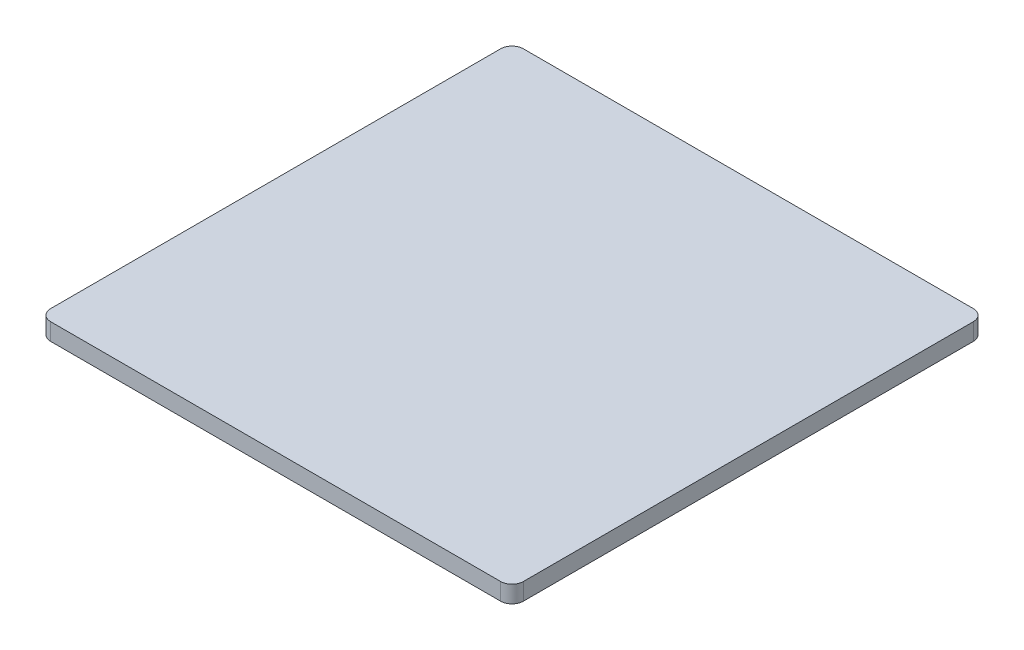
ISO-10303-21;
HEADER;
FILE_DESCRIPTION(('STEP AP214'),'2;1');
FILE_NAME('part.step','',(''),(''),'','','');
FILE_SCHEMA(('AUTOMOTIVE_DESIGN { 1 0 10303 214 1 1 1 1 }'));
ENDSEC;
DATA;
#1=APPLICATION_CONTEXT('core data for automotive mechanical design processes');
#2=APPLICATION_PROTOCOL_DEFINITION('international standard','automotive_design',2000,#1);
#3=PRODUCT_CONTEXT('',#1,'mechanical');
#4=PRODUCT('Part','Part','',(#3));
#5=PRODUCT_RELATED_PRODUCT_CATEGORY('part','',(#4));
#6=PRODUCT_DEFINITION_FORMATION('','',#4);
#7=PRODUCT_DEFINITION_CONTEXT('part definition',#1,'design');
#8=PRODUCT_DEFINITION('design','',#6,#7);
#9=PRODUCT_DEFINITION_SHAPE('','',#8);
#10=(LENGTH_UNIT() NAMED_UNIT(*) SI_UNIT(.MILLI.,.METRE.));
#11=(NAMED_UNIT(*) PLANE_ANGLE_UNIT() SI_UNIT($,.RADIAN.));
#12=(NAMED_UNIT(*) SI_UNIT($,.STERADIAN.) SOLID_ANGLE_UNIT());
#13=UNCERTAINTY_MEASURE_WITH_UNIT(LENGTH_MEASURE(1.E-05),#10,'distance_accuracy_value','');
#14=(GEOMETRIC_REPRESENTATION_CONTEXT(3) GLOBAL_UNCERTAINTY_ASSIGNED_CONTEXT((#13)) GLOBAL_UNIT_ASSIGNED_CONTEXT((#10,
#11,#12)) REPRESENTATION_CONTEXT('',''));
#15=CARTESIAN_POINT('',(0.,0.,0.));
#16=DIRECTION('',(0.,0.,1.));
#17=DIRECTION('',(1.,0.,0.));
#18=AXIS2_PLACEMENT_3D('',#15,#16,#17);
#19=CARTESIAN_POINT('',(-197.5,-15.,-197.5));
#20=DIRECTION('',(0.,1.,0.));
#21=DIRECTION('',(0.,0.,1.));
#22=AXIS2_PLACEMENT_3D('',#19,#20,#21);
#23=CYLINDRICAL_SURFACE('',#22,10.);
#24=CARTESIAN_POINT('',(-197.5,0.,-197.5));
#25=DIRECTION('',(0.,1.,0.));
#26=DIRECTION('',(0.,0.,1.));
#27=AXIS2_PLACEMENT_3D('',#24,#25,#26);
#28=CIRCLE('',#27,10.);
#29=CARTESIAN_POINT('',(-197.5,0.,-207.5));
#30=VERTEX_POINT('',#29);
#31=CARTESIAN_POINT('',(-207.5,0.,-197.5));
#32=VERTEX_POINT('',#31);
#33=EDGE_CURVE('E328',#30,#32,#28,.T.);
#34=ORIENTED_EDGE('',*,*,#33,.F.);
#35=DIRECTION('',(0.,1.,0.));
#36=VECTOR('',#35,1.);
#37=CARTESIAN_POINT('',(-197.5,-15.,-207.5));
#38=LINE('',#37,#36);
#39=CARTESIAN_POINT('',(-197.5,-15.,-207.5));
#40=VERTEX_POINT('',#39);
#41=EDGE_CURVE('E391',#40,#30,#38,.T.);
#42=ORIENTED_EDGE('',*,*,#41,.F.);
#43=CARTESIAN_POINT('',(-197.5,-15.,-197.5));
#44=DIRECTION('',(0.,1.,0.));
#45=DIRECTION('',(0.,0.,1.));
#46=AXIS2_PLACEMENT_3D('',#43,#44,#45);
#47=CIRCLE('',#46,10.);
#48=CARTESIAN_POINT('',(-207.5,-15.,-197.5));
#49=VERTEX_POINT('',#48);
#50=EDGE_CURVE('E343',#40,#49,#47,.T.);
#51=ORIENTED_EDGE('',*,*,#50,.T.);
#52=DIRECTION('',(0.,1.,0.));
#53=VECTOR('',#52,1.);
#54=CARTESIAN_POINT('',(-207.5,-15.,-197.5));
#55=LINE('',#54,#53);
#56=EDGE_CURVE('E368',#49,#32,#55,.T.);
#57=ORIENTED_EDGE('',*,*,#56,.T.);
#58=EDGE_LOOP('',(#34,#42,#51,#57));
#59=FACE_BOUND('',#58,.T.);
#60=ADVANCED_FACE('F35',(#59),#23,.T.);
#61=CARTESIAN_POINT('',(-197.5,-15.,-207.5));
#62=DIRECTION('',(0.,0.,-1.));
#63=DIRECTION('',(-1.,0.,0.));
#64=AXIS2_PLACEMENT_3D('',#61,#62,#63);
#65=PLANE('',#64);
#66=DIRECTION('',(-1.,0.,0.));
#67=VECTOR('',#66,1.);
#68=CARTESIAN_POINT('',(-197.5,0.,-207.5));
#69=LINE('',#68,#67);
#70=CARTESIAN_POINT('',(197.5,0.,-207.5));
#71=VERTEX_POINT('',#70);
#72=EDGE_CURVE('E347',#71,#30,#69,.T.);
#73=ORIENTED_EDGE('',*,*,#72,.F.);
#74=DIRECTION('',(0.,1.,0.));
#75=VECTOR('',#74,1.);
#76=CARTESIAN_POINT('',(197.5,-15.,-207.5));
#77=LINE('',#76,#75);
#78=CARTESIAN_POINT('',(197.5,-15.,-207.5));
#79=VERTEX_POINT('',#78);
#80=EDGE_CURVE('E394',#79,#71,#77,.T.);
#81=ORIENTED_EDGE('',*,*,#80,.F.);
#82=DIRECTION('',(-1.,0.,0.));
#83=VECTOR('',#82,1.);
#84=CARTESIAN_POINT('',(-197.5,-15.,-207.5));
#85=LINE('',#84,#83);
#86=EDGE_CURVE('E365',#79,#40,#85,.T.);
#87=ORIENTED_EDGE('',*,*,#86,.T.);
#88=ORIENTED_EDGE('',*,*,#41,.T.);
#89=EDGE_LOOP('',(#73,#81,#87,#88));
#90=FACE_BOUND('',#89,.T.);
#91=ADVANCED_FACE('F513',(#90),#65,.T.);
#92=CARTESIAN_POINT('',(197.5,-15.,-197.5));
#93=DIRECTION('',(0.,1.,0.));
#94=DIRECTION('',(0.,0.,1.));
#95=AXIS2_PLACEMENT_3D('',#92,#93,#94);
#96=CYLINDRICAL_SURFACE('',#95,10.);
#97=CARTESIAN_POINT('',(197.5,0.,-197.5));
#98=DIRECTION('',(0.,1.,0.));
#99=DIRECTION('',(0.,0.,-1.));
#100=AXIS2_PLACEMENT_3D('',#97,#98,#99);
#101=CIRCLE('',#100,10.);
#102=CARTESIAN_POINT('',(207.5,0.,-197.5));
#103=VERTEX_POINT('',#102);
#104=EDGE_CURVE('E386',#103,#71,#101,.T.);
#105=ORIENTED_EDGE('',*,*,#104,.F.);
#106=DIRECTION('',(0.,1.,0.));
#107=VECTOR('',#106,1.);
#108=CARTESIAN_POINT('',(207.5,-15.,-197.5));
#109=LINE('',#108,#107);
#110=CARTESIAN_POINT('',(207.5,-15.,-197.5));
#111=VERTEX_POINT('',#110);
#112=EDGE_CURVE('E396',#111,#103,#109,.T.);
#113=ORIENTED_EDGE('',*,*,#112,.F.);
#114=CARTESIAN_POINT('',(197.5,-15.,-197.5));
#115=DIRECTION('',(0.,1.,0.));
#116=DIRECTION('',(0.,0.,-1.));
#117=AXIS2_PLACEMENT_3D('',#114,#115,#116);
#118=CIRCLE('',#117,10.);
#119=EDGE_CURVE('E362',#111,#79,#118,.T.);
#120=ORIENTED_EDGE('',*,*,#119,.T.);
#121=ORIENTED_EDGE('',*,*,#80,.T.);
#122=EDGE_LOOP('',(#105,#113,#120,#121));
#123=FACE_BOUND('',#122,.T.);
#124=ADVANCED_FACE('F519',(#123),#96,.T.);
#125=CARTESIAN_POINT('',(207.5,-15.,-197.5));
#126=DIRECTION('',(1.,0.,0.));
#127=DIRECTION('',(0.,0.,-1.));
#128=AXIS2_PLACEMENT_3D('',#125,#126,#127);
#129=PLANE('',#128);
#130=DIRECTION('',(0.,0.,-1.));
#131=VECTOR('',#130,1.);
#132=CARTESIAN_POINT('',(207.5,0.,-197.5));
#133=LINE('',#132,#131);
#134=CARTESIAN_POINT('',(207.5,0.,197.5));
#135=VERTEX_POINT('',#134);
#136=EDGE_CURVE('E383',#135,#103,#133,.T.);
#137=ORIENTED_EDGE('',*,*,#136,.F.);
#138=DIRECTION('',(0.,1.,0.));
#139=VECTOR('',#138,1.);
#140=CARTESIAN_POINT('',(207.5,-15.,197.5));
#141=LINE('',#140,#139);
#142=CARTESIAN_POINT('',(207.5,-15.,197.5));
#143=VERTEX_POINT('',#142);
#144=EDGE_CURVE('E398',#143,#135,#141,.T.);
#145=ORIENTED_EDGE('',*,*,#144,.F.);
#146=DIRECTION('',(0.,0.,-1.));
#147=VECTOR('',#146,1.);
#148=CARTESIAN_POINT('',(207.5,-15.,-197.5));
#149=LINE('',#148,#147);
#150=EDGE_CURVE('E359',#143,#111,#149,.T.);
#151=ORIENTED_EDGE('',*,*,#150,.T.);
#152=ORIENTED_EDGE('',*,*,#112,.T.);
#153=EDGE_LOOP('',(#137,#145,#151,#152));
#154=FACE_BOUND('',#153,.T.);
#155=ADVANCED_FACE('F578',(#154),#129,.T.);
#156=CARTESIAN_POINT('',(197.5,-15.,197.5));
#157=DIRECTION('',(0.,1.,0.));
#158=DIRECTION('',(0.,0.,1.));
#159=AXIS2_PLACEMENT_3D('',#156,#157,#158);
#160=CYLINDRICAL_SURFACE('',#159,10.);
#161=CARTESIAN_POINT('',(197.5,0.,197.5));
#162=DIRECTION('',(0.,1.,0.));
#163=DIRECTION('',(0.,0.,1.));
#164=AXIS2_PLACEMENT_3D('',#161,#162,#163);
#165=CIRCLE('',#164,10.);
#166=CARTESIAN_POINT('',(197.5,0.,207.5));
#167=VERTEX_POINT('',#166);
#168=EDGE_CURVE('E380',#167,#135,#165,.T.);
#169=ORIENTED_EDGE('',*,*,#168,.F.);
#170=DIRECTION('',(0.,1.,0.));
#171=VECTOR('',#170,1.);
#172=CARTESIAN_POINT('',(197.5,-15.,207.5));
#173=LINE('',#172,#171);
#174=CARTESIAN_POINT('',(197.5,-15.,207.5));
#175=VERTEX_POINT('',#174);
#176=EDGE_CURVE('E400',#175,#167,#173,.T.);
#177=ORIENTED_EDGE('',*,*,#176,.F.);
#178=CARTESIAN_POINT('',(197.5,-15.,197.5));
#179=DIRECTION('',(0.,1.,0.));
#180=DIRECTION('',(0.,0.,1.));
#181=AXIS2_PLACEMENT_3D('',#178,#179,#180);
#182=CIRCLE('',#181,10.);
#183=EDGE_CURVE('E356',#175,#143,#182,.T.);
#184=ORIENTED_EDGE('',*,*,#183,.T.);
#185=ORIENTED_EDGE('',*,*,#144,.T.);
#186=EDGE_LOOP('',(#169,#177,#184,#185));
#187=FACE_BOUND('',#186,.T.);
#188=ADVANCED_FACE('F581',(#187),#160,.T.);
#189=CARTESIAN_POINT('',(-197.5,-15.,207.5));
#190=DIRECTION('',(0.,0.,1.));
#191=DIRECTION('',(1.,0.,0.));
#192=AXIS2_PLACEMENT_3D('',#189,#190,#191);
#193=PLANE('',#192);
#194=DIRECTION('',(1.,0.,0.));
#195=VECTOR('',#194,1.);
#196=CARTESIAN_POINT('',(-197.5,0.,207.5));
#197=LINE('',#196,#195);
#198=CARTESIAN_POINT('',(-197.5,0.,207.5));
#199=VERTEX_POINT('',#198);
#200=EDGE_CURVE('E377',#199,#167,#197,.T.);
#201=ORIENTED_EDGE('',*,*,#200,.F.);
#202=DIRECTION('',(0.,1.,0.));
#203=VECTOR('',#202,1.);
#204=CARTESIAN_POINT('',(-197.5,-15.,207.5));
#205=LINE('',#204,#203);
#206=CARTESIAN_POINT('',(-197.5,-15.,207.5));
#207=VERTEX_POINT('',#206);
#208=EDGE_CURVE('E402',#207,#199,#205,.T.);
#209=ORIENTED_EDGE('',*,*,#208,.F.);
#210=DIRECTION('',(1.,0.,0.));
#211=VECTOR('',#210,1.);
#212=CARTESIAN_POINT('',(-197.5,-15.,207.5));
#213=LINE('',#212,#211);
#214=EDGE_CURVE('E353',#207,#175,#213,.T.);
#215=ORIENTED_EDGE('',*,*,#214,.T.);
#216=ORIENTED_EDGE('',*,*,#176,.T.);
#217=EDGE_LOOP('',(#201,#209,#215,#216));
#218=FACE_BOUND('',#217,.T.);
#219=ADVANCED_FACE('F585',(#218),#193,.T.);
#220=CARTESIAN_POINT('',(-197.5,-15.,197.5));
#221=DIRECTION('',(0.,1.,0.));
#222=DIRECTION('',(0.,0.,1.));
#223=AXIS2_PLACEMENT_3D('',#220,#221,#222);
#224=CYLINDRICAL_SURFACE('',#223,10.);
#225=CARTESIAN_POINT('',(-197.5,0.,197.5));
#226=DIRECTION('',(0.,1.,0.));
#227=DIRECTION('',(0.,0.,1.));
#228=AXIS2_PLACEMENT_3D('',#225,#226,#227);
#229=CIRCLE('',#228,10.);
#230=CARTESIAN_POINT('',(-207.5,0.,197.5));
#231=VERTEX_POINT('',#230);
#232=EDGE_CURVE('E374',#231,#199,#229,.T.);
#233=ORIENTED_EDGE('',*,*,#232,.F.);
#234=DIRECTION('',(0.,1.,0.));
#235=VECTOR('',#234,1.);
#236=CARTESIAN_POINT('',(-207.5,-15.,197.5));
#237=LINE('',#236,#235);
#238=CARTESIAN_POINT('',(-207.5,-15.,197.5));
#239=VERTEX_POINT('',#238);
#240=EDGE_CURVE('E404',#239,#231,#237,.T.);
#241=ORIENTED_EDGE('',*,*,#240,.F.);
#242=CARTESIAN_POINT('',(-197.5,-15.,197.5));
#243=DIRECTION('',(0.,1.,0.));
#244=DIRECTION('',(0.,0.,1.));
#245=AXIS2_PLACEMENT_3D('',#242,#243,#244);
#246=CIRCLE('',#245,10.);
#247=EDGE_CURVE('E350',#239,#207,#246,.T.);
#248=ORIENTED_EDGE('',*,*,#247,.T.);
#249=ORIENTED_EDGE('',*,*,#208,.T.);
#250=EDGE_LOOP('',(#233,#241,#248,#249));
#251=FACE_BOUND('',#250,.T.);
#252=ADVANCED_FACE('F560',(#251),#224,.T.);
#253=CARTESIAN_POINT('',(-207.5,-15.,-197.5));
#254=DIRECTION('',(-1.,0.,0.));
#255=DIRECTION('',(0.,0.,1.));
#256=AXIS2_PLACEMENT_3D('',#253,#254,#255);
#257=PLANE('',#256);
#258=DIRECTION('',(0.,0.,1.));
#259=VECTOR('',#258,1.);
#260=CARTESIAN_POINT('',(-207.5,0.,-197.5));
#261=LINE('',#260,#259);
#262=EDGE_CURVE('E371',#32,#231,#261,.T.);
#263=ORIENTED_EDGE('',*,*,#262,.F.);
#264=ORIENTED_EDGE('',*,*,#56,.F.);
#265=DIRECTION('',(0.,0.,1.));
#266=VECTOR('',#265,1.);
#267=CARTESIAN_POINT('',(-207.5,-15.,-197.5));
#268=LINE('',#267,#266);
#269=EDGE_CURVE('E346',#49,#239,#268,.T.);
#270=ORIENTED_EDGE('',*,*,#269,.T.);
#271=ORIENTED_EDGE('',*,*,#240,.T.);
#272=EDGE_LOOP('',(#263,#264,#270,#271));
#273=FACE_BOUND('',#272,.T.);
#274=ADVANCED_FACE('F525',(#273),#257,.T.);
#275=CARTESIAN_POINT('',(-197.5,-15.,-197.5));
#276=DIRECTION('',(0.,1.,0.));
#277=DIRECTION('',(0.,0.,1.));
#278=AXIS2_PLACEMENT_3D('',#275,#276,#277);
#279=PLANE('',#278);
#280=DIRECTION('',(1.,0.,0.));
#281=VECTOR('',#280,1.);
#282=CARTESIAN_POINT('',(-190.,-15.,-200.));
#283=LINE('',#282,#281);
#284=CARTESIAN_POINT('',(-190.,-15.,-200.));
#285=VERTEX_POINT('',#284);
#286=CARTESIAN_POINT('',(190.,-15.,-200.));
#287=VERTEX_POINT('',#286);
#288=EDGE_CURVE('E306',#285,#287,#283,.T.);
#289=ORIENTED_EDGE('',*,*,#288,.F.);
#290=DIRECTION('',(0.707106781186547,0.,-0.707106781186547));
#291=VECTOR('',#290,1.);
#292=CARTESIAN_POINT('',(-200.,-15.,-190.));
#293=LINE('',#292,#291);
#294=CARTESIAN_POINT('',(-200.,-15.,-190.));
#295=VERTEX_POINT('',#294);
#296=EDGE_CURVE('E263',#295,#285,#293,.T.);
#297=ORIENTED_EDGE('',*,*,#296,.F.);
#298=DIRECTION('',(0.,0.,-1.));
#299=VECTOR('',#298,1.);
#300=CARTESIAN_POINT('',(-200.,-15.,-190.));
#301=LINE('',#300,#299);
#302=CARTESIAN_POINT('',(-200.,-15.,190.));
#303=VERTEX_POINT('',#302);
#304=EDGE_CURVE('E283',#303,#295,#301,.T.);
#305=ORIENTED_EDGE('',*,*,#304,.F.);
#306=DIRECTION('',(-0.707106781186547,0.,-0.707106781186547));
#307=VECTOR('',#306,1.);
#308=CARTESIAN_POINT('',(-200.,-15.,190.));
#309=LINE('',#308,#307);
#310=CARTESIAN_POINT('',(-190.,-15.,200.));
#311=VERTEX_POINT('',#310);
#312=EDGE_CURVE('E321',#311,#303,#309,.T.);
#313=ORIENTED_EDGE('',*,*,#312,.F.);
#314=DIRECTION('',(-1.,0.,0.));
#315=VECTOR('',#314,1.);
#316=CARTESIAN_POINT('',(-190.,-15.,200.));
#317=LINE('',#316,#315);
#318=CARTESIAN_POINT('',(190.,-15.,200.));
#319=VERTEX_POINT('',#318);
#320=EDGE_CURVE('E318',#319,#311,#317,.T.);
#321=ORIENTED_EDGE('',*,*,#320,.F.);
#322=DIRECTION('',(-0.707106781186547,0.,0.707106781186547));
#323=VECTOR('',#322,1.);
#324=CARTESIAN_POINT('',(190.,-15.,200.));
#325=LINE('',#324,#323);
#326=CARTESIAN_POINT('',(200.,-15.,190.));
#327=VERTEX_POINT('',#326);
#328=EDGE_CURVE('E315',#327,#319,#325,.T.);
#329=ORIENTED_EDGE('',*,*,#328,.F.);
#330=DIRECTION('',(0.,0.,1.));
#331=VECTOR('',#330,1.);
#332=CARTESIAN_POINT('',(200.,-15.,-190.));
#333=LINE('',#332,#331);
#334=CARTESIAN_POINT('',(200.,-15.,-190.));
#335=VERTEX_POINT('',#334);
#336=EDGE_CURVE('E312',#335,#327,#333,.T.);
#337=ORIENTED_EDGE('',*,*,#336,.F.);
#338=DIRECTION('',(0.707106781186547,0.,0.707106781186547));
#339=VECTOR('',#338,1.);
#340=CARTESIAN_POINT('',(190.,-15.,-200.));
#341=LINE('',#340,#339);
#342=EDGE_CURVE('E309',#287,#335,#341,.T.);
#343=ORIENTED_EDGE('',*,*,#342,.F.);
#344=EDGE_LOOP('',(#289,#297,#305,#313,#321,#329,#337,#343));
#345=FACE_BOUND('',#344,.T.);
#346=ORIENTED_EDGE('',*,*,#50,.F.);
#347=ORIENTED_EDGE('',*,*,#86,.F.);
#348=ORIENTED_EDGE('',*,*,#119,.F.);
#349=ORIENTED_EDGE('',*,*,#150,.F.);
#350=ORIENTED_EDGE('',*,*,#183,.F.);
#351=ORIENTED_EDGE('',*,*,#214,.F.);
#352=ORIENTED_EDGE('',*,*,#247,.F.);
#353=ORIENTED_EDGE('',*,*,#269,.F.);
#354=EDGE_LOOP('',(#346,#347,#348,#349,#350,#351,#352,#353));
#355=FACE_BOUND('',#354,.T.);
#356=ADVANCED_FACE('F546',(#345,#355),#279,.F.);
#357=CARTESIAN_POINT('',(-197.5,0.,-197.5));
#358=DIRECTION('',(0.,1.,0.));
#359=DIRECTION('',(0.,0.,1.));
#360=AXIS2_PLACEMENT_3D('',#357,#358,#359);
#361=PLANE('',#360);
#362=ORIENTED_EDGE('',*,*,#33,.T.);
#363=ORIENTED_EDGE('',*,*,#262,.T.);
#364=ORIENTED_EDGE('',*,*,#232,.T.);
#365=ORIENTED_EDGE('',*,*,#200,.T.);
#366=ORIENTED_EDGE('',*,*,#168,.T.);
#367=ORIENTED_EDGE('',*,*,#136,.T.);
#368=ORIENTED_EDGE('',*,*,#104,.T.);
#369=ORIENTED_EDGE('',*,*,#72,.T.);
#370=EDGE_LOOP('',(#362,#363,#364,#365,#366,#367,#368,#369));
#371=FACE_BOUND('',#370,.T.);
#372=ADVANCED_FACE('F552',(#371),#361,.T.);
#373=CARTESIAN_POINT('',(-200.,-4.5,-190.));
#374=DIRECTION('',(-0.707106781186547,0.,-0.707106781186547));
#375=DIRECTION('',(-0.707106781186548,0.,0.707106781186548));
#376=AXIS2_PLACEMENT_3D('',#373,#374,#375);
#377=PLANE('',#376);
#378=ORIENTED_EDGE('',*,*,#296,.T.);
#379=DIRECTION('',(0.,-1.,0.));
#380=VECTOR('',#379,1.);
#381=CARTESIAN_POINT('',(-190.,-4.5,-200.));
#382=LINE('',#381,#380);
#383=CARTESIAN_POINT('',(-190.,-4.5,-200.));
#384=VERTEX_POINT('',#383);
#385=EDGE_CURVE('E304',#384,#285,#382,.T.);
#386=ORIENTED_EDGE('',*,*,#385,.F.);
#387=DIRECTION('',(0.707106781186547,0.,-0.707106781186547));
#388=VECTOR('',#387,1.);
#389=CARTESIAN_POINT('',(-200.,-4.5,-190.));
#390=LINE('',#389,#388);
#391=CARTESIAN_POINT('',(-200.,-4.5,-190.));
#392=VERTEX_POINT('',#391);
#393=EDGE_CURVE('E279',#392,#384,#390,.T.);
#394=ORIENTED_EDGE('',*,*,#393,.F.);
#395=DIRECTION('',(0.,-1.,0.));
#396=VECTOR('',#395,1.);
#397=CARTESIAN_POINT('',(-200.,-4.5,-190.));
#398=LINE('',#397,#396);
#399=EDGE_CURVE('E326',#392,#295,#398,.T.);
#400=ORIENTED_EDGE('',*,*,#399,.T.);
#401=EDGE_LOOP('',(#378,#386,#394,#400));
#402=FACE_BOUND('',#401,.T.);
#403=ADVANCED_FACE('F558',(#402),#377,.F.);
#404=CARTESIAN_POINT('',(-200.,-4.5,-190.));
#405=DIRECTION('',(-1.,0.,0.));
#406=DIRECTION('',(0.,0.,1.));
#407=AXIS2_PLACEMENT_3D('',#404,#405,#406);
#408=PLANE('',#407);
#409=ORIENTED_EDGE('',*,*,#304,.T.);
#410=ORIENTED_EDGE('',*,*,#399,.F.);
#411=DIRECTION('',(0.,0.,-1.));
#412=VECTOR('',#411,1.);
#413=CARTESIAN_POINT('',(-200.,-4.5,-190.));
#414=LINE('',#413,#412);
#415=CARTESIAN_POINT('',(-200.,-4.5,190.));
#416=VERTEX_POINT('',#415);
#417=EDGE_CURVE('E301',#416,#392,#414,.T.);
#418=ORIENTED_EDGE('',*,*,#417,.F.);
#419=DIRECTION('',(0.,-1.,0.));
#420=VECTOR('',#419,1.);
#421=CARTESIAN_POINT('',(-200.,-4.5,190.));
#422=LINE('',#421,#420);
#423=EDGE_CURVE('E329',#416,#303,#422,.T.);
#424=ORIENTED_EDGE('',*,*,#423,.T.);
#425=EDGE_LOOP('',(#409,#410,#418,#424));
#426=FACE_BOUND('',#425,.T.);
#427=ADVANCED_FACE('F646',(#426),#408,.F.);
#428=CARTESIAN_POINT('',(-200.,-4.5,190.));
#429=DIRECTION('',(-0.707106781186547,0.,0.707106781186547));
#430=DIRECTION('',(0.707106781186548,0.,0.707106781186548));
#431=AXIS2_PLACEMENT_3D('',#428,#429,#430);
#432=PLANE('',#431);
#433=ORIENTED_EDGE('',*,*,#312,.T.);
#434=ORIENTED_EDGE('',*,*,#423,.F.);
#435=DIRECTION('',(-0.707106781186547,0.,-0.707106781186547));
#436=VECTOR('',#435,1.);
#437=CARTESIAN_POINT('',(-200.,-4.5,190.));
#438=LINE('',#437,#436);
#439=CARTESIAN_POINT('',(-190.,-4.5,200.));
#440=VERTEX_POINT('',#439);
#441=EDGE_CURVE('E298',#440,#416,#438,.T.);
#442=ORIENTED_EDGE('',*,*,#441,.F.);
#443=DIRECTION('',(0.,-1.,0.));
#444=VECTOR('',#443,1.);
#445=CARTESIAN_POINT('',(-190.,-4.5,200.));
#446=LINE('',#445,#444);
#447=EDGE_CURVE('E331',#440,#311,#446,.T.);
#448=ORIENTED_EDGE('',*,*,#447,.T.);
#449=EDGE_LOOP('',(#433,#434,#442,#448));
#450=FACE_BOUND('',#449,.T.);
#451=ADVANCED_FACE('F655',(#450),#432,.F.);
#452=CARTESIAN_POINT('',(-190.,-4.5,200.));
#453=DIRECTION('',(0.,0.,1.));
#454=DIRECTION('',(1.,0.,0.));
#455=AXIS2_PLACEMENT_3D('',#452,#453,#454);
#456=PLANE('',#455);
#457=ORIENTED_EDGE('',*,*,#320,.T.);
#458=ORIENTED_EDGE('',*,*,#447,.F.);
#459=DIRECTION('',(-1.,0.,0.));
#460=VECTOR('',#459,1.);
#461=CARTESIAN_POINT('',(-190.,-4.5,200.));
#462=LINE('',#461,#460);
#463=CARTESIAN_POINT('',(190.,-4.5,200.));
#464=VERTEX_POINT('',#463);
#465=EDGE_CURVE('E295',#464,#440,#462,.T.);
#466=ORIENTED_EDGE('',*,*,#465,.F.);
#467=DIRECTION('',(0.,-1.,0.));
#468=VECTOR('',#467,1.);
#469=CARTESIAN_POINT('',(190.,-4.5,200.));
#470=LINE('',#469,#468);
#471=EDGE_CURVE('E333',#464,#319,#470,.T.);
#472=ORIENTED_EDGE('',*,*,#471,.T.);
#473=EDGE_LOOP('',(#457,#458,#466,#472));
#474=FACE_BOUND('',#473,.T.);
#475=ADVANCED_FACE('F665',(#474),#456,.F.);
#476=CARTESIAN_POINT('',(190.,-4.5,200.));
#477=DIRECTION('',(0.707106781186547,0.,0.707106781186547));
#478=DIRECTION('',(0.707106781186548,0.,-0.707106781186548));
#479=AXIS2_PLACEMENT_3D('',#476,#477,#478);
#480=PLANE('',#479);
#481=ORIENTED_EDGE('',*,*,#328,.T.);
#482=ORIENTED_EDGE('',*,*,#471,.F.);
#483=DIRECTION('',(-0.707106781186547,0.,0.707106781186547));
#484=VECTOR('',#483,1.);
#485=CARTESIAN_POINT('',(190.,-4.5,200.));
#486=LINE('',#485,#484);
#487=CARTESIAN_POINT('',(200.,-4.5,190.));
#488=VERTEX_POINT('',#487);
#489=EDGE_CURVE('E292',#488,#464,#486,.T.);
#490=ORIENTED_EDGE('',*,*,#489,.F.);
#491=DIRECTION('',(0.,-1.,0.));
#492=VECTOR('',#491,1.);
#493=CARTESIAN_POINT('',(200.,-4.5,190.));
#494=LINE('',#493,#492);
#495=EDGE_CURVE('E335',#488,#327,#494,.T.);
#496=ORIENTED_EDGE('',*,*,#495,.T.);
#497=EDGE_LOOP('',(#481,#482,#490,#496));
#498=FACE_BOUND('',#497,.T.);
#499=ADVANCED_FACE('F675',(#498),#480,.F.);
#500=CARTESIAN_POINT('',(200.,-4.5,-190.));
#501=DIRECTION('',(1.,0.,0.));
#502=DIRECTION('',(0.,0.,-1.));
#503=AXIS2_PLACEMENT_3D('',#500,#501,#502);
#504=PLANE('',#503);
#505=ORIENTED_EDGE('',*,*,#336,.T.);
#506=ORIENTED_EDGE('',*,*,#495,.F.);
#507=DIRECTION('',(0.,0.,1.));
#508=VECTOR('',#507,1.);
#509=CARTESIAN_POINT('',(200.,-4.5,-190.));
#510=LINE('',#509,#508);
#511=CARTESIAN_POINT('',(200.,-4.5,-190.));
#512=VERTEX_POINT('',#511);
#513=EDGE_CURVE('E289',#512,#488,#510,.T.);
#514=ORIENTED_EDGE('',*,*,#513,.F.);
#515=DIRECTION('',(0.,-1.,0.));
#516=VECTOR('',#515,1.);
#517=CARTESIAN_POINT('',(200.,-4.5,-190.));
#518=LINE('',#517,#516);
#519=EDGE_CURVE('E337',#512,#335,#518,.T.);
#520=ORIENTED_EDGE('',*,*,#519,.T.);
#521=EDGE_LOOP('',(#505,#506,#514,#520));
#522=FACE_BOUND('',#521,.T.);
#523=ADVANCED_FACE('F685',(#522),#504,.F.);
#524=CARTESIAN_POINT('',(190.,-4.5,-200.));
#525=DIRECTION('',(0.707106781186547,0.,-0.707106781186547));
#526=DIRECTION('',(-0.707106781186548,0.,-0.707106781186548));
#527=AXIS2_PLACEMENT_3D('',#524,#525,#526);
#528=PLANE('',#527);
#529=ORIENTED_EDGE('',*,*,#342,.T.);
#530=ORIENTED_EDGE('',*,*,#519,.F.);
#531=DIRECTION('',(0.707106781186547,0.,0.707106781186547));
#532=VECTOR('',#531,1.);
#533=CARTESIAN_POINT('',(190.,-4.5,-200.));
#534=LINE('',#533,#532);
#535=CARTESIAN_POINT('',(190.,-4.5,-200.));
#536=VERTEX_POINT('',#535);
#537=EDGE_CURVE('E286',#536,#512,#534,.T.);
#538=ORIENTED_EDGE('',*,*,#537,.F.);
#539=DIRECTION('',(0.,-1.,0.));
#540=VECTOR('',#539,1.);
#541=CARTESIAN_POINT('',(190.,-4.5,-200.));
#542=LINE('',#541,#540);
#543=EDGE_CURVE('E339',#536,#287,#542,.T.);
#544=ORIENTED_EDGE('',*,*,#543,.T.);
#545=EDGE_LOOP('',(#529,#530,#538,#544));
#546=FACE_BOUND('',#545,.T.);
#547=ADVANCED_FACE('F695',(#546),#528,.F.);
#548=CARTESIAN_POINT('',(-190.,-4.5,-200.));
#549=DIRECTION('',(0.,0.,-1.));
#550=DIRECTION('',(-1.,0.,0.));
#551=AXIS2_PLACEMENT_3D('',#548,#549,#550);
#552=PLANE('',#551);
#553=ORIENTED_EDGE('',*,*,#288,.T.);
#554=ORIENTED_EDGE('',*,*,#543,.F.);
#555=DIRECTION('',(1.,0.,0.));
#556=VECTOR('',#555,1.);
#557=CARTESIAN_POINT('',(-190.,-4.5,-200.));
#558=LINE('',#557,#556);
#559=EDGE_CURVE('E282',#384,#536,#558,.T.);
#560=ORIENTED_EDGE('',*,*,#559,.F.);
#561=ORIENTED_EDGE('',*,*,#385,.T.);
#562=EDGE_LOOP('',(#553,#554,#560,#561));
#563=FACE_BOUND('',#562,.T.);
#564=ADVANCED_FACE('F705',(#563),#552,.F.);
#565=CARTESIAN_POINT('',(0.,-4.5,0.));
#566=DIRECTION('',(0.,-1.,0.));
#567=DIRECTION('',(0.,0.,-1.));
#568=AXIS2_PLACEMENT_3D('',#565,#566,#567);
#569=PLANE('',#568);
#570=DIRECTION('',(1.,0.,0.));
#571=VECTOR('',#570,1.);
#572=CARTESIAN_POINT('',(-175.,-4.5,-195.));
#573=LINE('',#572,#571);
#574=CARTESIAN_POINT('',(-175.,-4.5,-195.));
#575=VERTEX_POINT('',#574);
#576=CARTESIAN_POINT('',(175.,-4.5,-195.));
#577=VERTEX_POINT('',#576);
#578=EDGE_CURVE('E228',#575,#577,#573,.T.);
#579=ORIENTED_EDGE('',*,*,#578,.F.);
#580=CARTESIAN_POINT('',(-175.,-4.5,-175.));
#581=DIRECTION('',(0.,-1.,0.));
#582=DIRECTION('',(0.,0.,1.));
#583=AXIS2_PLACEMENT_3D('',#580,#581,#582);
#584=CIRCLE('',#583,20.);
#585=CARTESIAN_POINT('',(-195.,-4.5,-175.));
#586=VERTEX_POINT('',#585);
#587=EDGE_CURVE('E258',#586,#575,#584,.T.);
#588=ORIENTED_EDGE('',*,*,#587,.F.);
#589=DIRECTION('',(0.,0.,-1.));
#590=VECTOR('',#589,1.);
#591=CARTESIAN_POINT('',(-195.,-4.5,-175.));
#592=LINE('',#591,#590);
#593=CARTESIAN_POINT('',(-195.,-4.5,175.));
#594=VERTEX_POINT('',#593);
#595=EDGE_CURVE('E255',#594,#586,#592,.T.);
#596=ORIENTED_EDGE('',*,*,#595,.F.);
#597=CARTESIAN_POINT('',(-175.,-4.5,175.));
#598=DIRECTION('',(0.,-1.,0.));
#599=DIRECTION('',(0.,0.,-1.));
#600=AXIS2_PLACEMENT_3D('',#597,#598,#599);
#601=CIRCLE('',#600,20.);
#602=CARTESIAN_POINT('',(-175.,-4.5,195.));
#603=VERTEX_POINT('',#602);
#604=EDGE_CURVE('E252',#603,#594,#601,.T.);
#605=ORIENTED_EDGE('',*,*,#604,.F.);
#606=DIRECTION('',(-1.,0.,0.));
#607=VECTOR('',#606,1.);
#608=CARTESIAN_POINT('',(-175.,-4.5,195.));
#609=LINE('',#608,#607);
#610=CARTESIAN_POINT('',(175.,-4.5,195.));
#611=VERTEX_POINT('',#610);
#612=EDGE_CURVE('E249',#611,#603,#609,.T.);
#613=ORIENTED_EDGE('',*,*,#612,.F.);
#614=CARTESIAN_POINT('',(175.,-4.5,175.));
#615=DIRECTION('',(0.,-1.,0.));
#616=DIRECTION('',(0.,0.,-1.));
#617=AXIS2_PLACEMENT_3D('',#614,#615,#616);
#618=CIRCLE('',#617,20.);
#619=CARTESIAN_POINT('',(195.,-4.5,175.));
#620=VERTEX_POINT('',#619);
#621=EDGE_CURVE('E239',#620,#611,#618,.T.);
#622=ORIENTED_EDGE('',*,*,#621,.F.);
#623=DIRECTION('',(0.,0.,1.));
#624=VECTOR('',#623,1.);
#625=CARTESIAN_POINT('',(195.,-4.5,-175.));
#626=LINE('',#625,#624);
#627=CARTESIAN_POINT('',(195.,-4.5,-175.));
#628=VERTEX_POINT('',#627);
#629=EDGE_CURVE('E223',#628,#620,#626,.T.);
#630=ORIENTED_EDGE('',*,*,#629,.F.);
#631=CARTESIAN_POINT('',(175.,-4.5,-175.));
#632=DIRECTION('',(0.,-1.,0.));
#633=DIRECTION('',(0.,0.,1.));
#634=AXIS2_PLACEMENT_3D('',#631,#632,#633);
#635=CIRCLE('',#634,20.);
#636=EDGE_CURVE('E235',#577,#628,#635,.T.);
#637=ORIENTED_EDGE('',*,*,#636,.F.);
#638=EDGE_LOOP('',(#579,#588,#596,#605,#613,#622,#630,#637));
#639=FACE_BOUND('',#638,.T.);
#640=ORIENTED_EDGE('',*,*,#393,.T.);
#641=ORIENTED_EDGE('',*,*,#559,.T.);
#642=ORIENTED_EDGE('',*,*,#537,.T.);
#643=ORIENTED_EDGE('',*,*,#513,.T.);
#644=ORIENTED_EDGE('',*,*,#489,.T.);
#645=ORIENTED_EDGE('',*,*,#465,.T.);
#646=ORIENTED_EDGE('',*,*,#441,.T.);
#647=ORIENTED_EDGE('',*,*,#417,.T.);
#648=EDGE_LOOP('',(#640,#641,#642,#643,#644,#645,#646,#647));
#649=FACE_BOUND('',#648,.T.);
#650=ADVANCED_FACE('F233',(#639,#649),#569,.T.);
#651=CARTESIAN_POINT('',(175.,-4.5,-175.));
#652=DIRECTION('',(0.,-1.,0.));
#653=DIRECTION('',(0.,0.,-1.));
#654=AXIS2_PLACEMENT_3D('',#651,#652,#653);
#655=CYLINDRICAL_SURFACE('',#654,20.);
#656=DIRECTION('',(0.,-1.,0.));
#657=VECTOR('',#656,1.);
#658=CARTESIAN_POINT('',(195.,-4.5,-175.));
#659=LINE('',#658,#657);
#660=CARTESIAN_POINT('',(195.,-5.00000000000021,-175.));
#661=VERTEX_POINT('',#660);
#662=EDGE_CURVE('E220',#628,#661,#659,.T.);
#663=ORIENTED_EDGE('',*,*,#662,.T.);
#664=CARTESIAN_POINT('',(175.,-5.00000000000021,-175.));
#665=DIRECTION('',(0.,1.,0.));
#666=DIRECTION('',(0.,0.,1.));
#667=AXIS2_PLACEMENT_3D('',#664,#665,#666);
#668=CIRCLE('',#667,20.);
#669=CARTESIAN_POINT('',(175.,-5.00000000000021,-195.));
#670=VERTEX_POINT('',#669);
#671=EDGE_CURVE('E11',#661,#670,#668,.T.);
#672=ORIENTED_EDGE('',*,*,#671,.T.);
#673=DIRECTION('',(0.,-1.,0.));
#674=VECTOR('',#673,1.);
#675=CARTESIAN_POINT('',(175.,-4.5,-195.));
#676=LINE('',#675,#674);
#677=EDGE_CURVE('E243',#577,#670,#676,.T.);
#678=ORIENTED_EDGE('',*,*,#677,.F.);
#679=ORIENTED_EDGE('',*,*,#636,.T.);
#680=EDGE_LOOP('',(#663,#672,#678,#679));
#681=FACE_BOUND('',#680,.T.);
#682=ADVANCED_FACE('F241',(#681),#655,.T.);
#683=CARTESIAN_POINT('',(-175.,-4.5,-195.));
#684=DIRECTION('',(0.,0.,-1.));
#685=DIRECTION('',(-1.,0.,0.));
#686=AXIS2_PLACEMENT_3D('',#683,#684,#685);
#687=PLANE('',#686);
#688=ORIENTED_EDGE('',*,*,#677,.T.);
#689=DIRECTION('',(-1.,0.,0.));
#690=VECTOR('',#689,1.);
#691=CARTESIAN_POINT('',(-175.,-5.0000000000002,-195.));
#692=LINE('',#691,#690);
#693=CARTESIAN_POINT('',(-175.,-5.00000000000021,-195.));
#694=VERTEX_POINT('',#693);
#695=EDGE_CURVE('E423',#670,#694,#692,.T.);
#696=ORIENTED_EDGE('',*,*,#695,.T.);
#697=DIRECTION('',(0.,-1.,0.));
#698=VECTOR('',#697,1.);
#699=CARTESIAN_POINT('',(-175.,-4.5,-195.));
#700=LINE('',#699,#698);
#701=EDGE_CURVE('E264',#575,#694,#700,.T.);
#702=ORIENTED_EDGE('',*,*,#701,.F.);
#703=ORIENTED_EDGE('',*,*,#578,.T.);
#704=EDGE_LOOP('',(#688,#696,#702,#703));
#705=FACE_BOUND('',#704,.T.);
#706=ADVANCED_FACE('F475',(#705),#687,.T.);
#707=CARTESIAN_POINT('',(-175.,-4.5,-175.));
#708=DIRECTION('',(0.,-1.,0.));
#709=DIRECTION('',(0.,0.,-1.));
#710=AXIS2_PLACEMENT_3D('',#707,#708,#709);
#711=CYLINDRICAL_SURFACE('',#710,20.);
#712=ORIENTED_EDGE('',*,*,#701,.T.);
#713=CARTESIAN_POINT('',(-175.,-5.00000000000021,-175.));
#714=DIRECTION('',(0.,1.,0.));
#715=DIRECTION('',(0.,0.,1.));
#716=AXIS2_PLACEMENT_3D('',#713,#714,#715);
#717=CIRCLE('',#716,20.);
#718=CARTESIAN_POINT('',(-195.,-5.0000000000002,-175.));
#719=VERTEX_POINT('',#718);
#720=EDGE_CURVE('E426',#694,#719,#717,.T.);
#721=ORIENTED_EDGE('',*,*,#720,.T.);
#722=DIRECTION('',(0.,-1.,0.));
#723=VECTOR('',#722,1.);
#724=CARTESIAN_POINT('',(-195.,-4.5,-175.));
#725=LINE('',#724,#723);
#726=EDGE_CURVE('E267',#586,#719,#725,.T.);
#727=ORIENTED_EDGE('',*,*,#726,.F.);
#728=ORIENTED_EDGE('',*,*,#587,.T.);
#729=EDGE_LOOP('',(#712,#721,#727,#728));
#730=FACE_BOUND('',#729,.T.);
#731=ADVANCED_FACE('F486',(#730),#711,.T.);
#732=CARTESIAN_POINT('',(-195.,-4.5,-175.));
#733=DIRECTION('',(-1.,0.,0.));
#734=DIRECTION('',(0.,0.,1.));
#735=AXIS2_PLACEMENT_3D('',#732,#733,#734);
#736=PLANE('',#735);
#737=ORIENTED_EDGE('',*,*,#726,.T.);
#738=DIRECTION('',(0.,0.,1.));
#739=VECTOR('',#738,1.);
#740=CARTESIAN_POINT('',(-195.,-5.0000000000002,175.));
#741=LINE('',#740,#739);
#742=CARTESIAN_POINT('',(-195.,-5.00000000000021,175.));
#743=VERTEX_POINT('',#742);
#744=EDGE_CURVE('E428',#719,#743,#741,.T.);
#745=ORIENTED_EDGE('',*,*,#744,.T.);
#746=DIRECTION('',(0.,-1.,0.));
#747=VECTOR('',#746,1.);
#748=CARTESIAN_POINT('',(-195.,-4.5,175.));
#749=LINE('',#748,#747);
#750=EDGE_CURVE('E270',#594,#743,#749,.T.);
#751=ORIENTED_EDGE('',*,*,#750,.F.);
#752=ORIENTED_EDGE('',*,*,#595,.T.);
#753=EDGE_LOOP('',(#737,#745,#751,#752));
#754=FACE_BOUND('',#753,.T.);
#755=ADVANCED_FACE('F490',(#754),#736,.T.);
#756=CARTESIAN_POINT('',(-175.,-4.5,175.));
#757=DIRECTION('',(0.,-1.,0.));
#758=DIRECTION('',(0.,0.,-1.));
#759=AXIS2_PLACEMENT_3D('',#756,#757,#758);
#760=CYLINDRICAL_SURFACE('',#759,20.);
#761=ORIENTED_EDGE('',*,*,#750,.T.);
#762=CARTESIAN_POINT('',(-175.,-5.00000000000021,175.));
#763=DIRECTION('',(0.,1.,0.));
#764=DIRECTION('',(0.,0.,1.));
#765=AXIS2_PLACEMENT_3D('',#762,#763,#764);
#766=CIRCLE('',#765,20.);
#767=CARTESIAN_POINT('',(-175.,-5.00000000000021,195.));
#768=VERTEX_POINT('',#767);
#769=EDGE_CURVE('E430',#743,#768,#766,.T.);
#770=ORIENTED_EDGE('',*,*,#769,.T.);
#771=DIRECTION('',(0.,-1.,0.));
#772=VECTOR('',#771,1.);
#773=CARTESIAN_POINT('',(-175.,-4.5,195.));
#774=LINE('',#773,#772);
#775=EDGE_CURVE('E273',#603,#768,#774,.T.);
#776=ORIENTED_EDGE('',*,*,#775,.F.);
#777=ORIENTED_EDGE('',*,*,#604,.T.);
#778=EDGE_LOOP('',(#761,#770,#776,#777));
#779=FACE_BOUND('',#778,.T.);
#780=ADVANCED_FACE('F499',(#779),#760,.T.);
#781=CARTESIAN_POINT('',(-175.,-4.5,195.));
#782=DIRECTION('',(0.,0.,1.));
#783=DIRECTION('',(1.,0.,0.));
#784=AXIS2_PLACEMENT_3D('',#781,#782,#783);
#785=PLANE('',#784);
#786=ORIENTED_EDGE('',*,*,#775,.T.);
#787=DIRECTION('',(1.,0.,0.));
#788=VECTOR('',#787,1.);
#789=CARTESIAN_POINT('',(175.,-5.00000000000021,195.));
#790=LINE('',#789,#788);
#791=CARTESIAN_POINT('',(175.,-5.00000000000021,195.));
#792=VERTEX_POINT('',#791);
#793=EDGE_CURVE('E432',#768,#792,#790,.T.);
#794=ORIENTED_EDGE('',*,*,#793,.T.);
#795=DIRECTION('',(0.,-1.,0.));
#796=VECTOR('',#795,1.);
#797=CARTESIAN_POINT('',(175.,-4.5,195.));
#798=LINE('',#797,#796);
#799=EDGE_CURVE('E276',#611,#792,#798,.T.);
#800=ORIENTED_EDGE('',*,*,#799,.F.);
#801=ORIENTED_EDGE('',*,*,#612,.T.);
#802=EDGE_LOOP('',(#786,#794,#800,#801));
#803=FACE_BOUND('',#802,.T.);
#804=ADVANCED_FACE('F502',(#803),#785,.T.);
#805=CARTESIAN_POINT('',(175.,-4.5,175.));
#806=DIRECTION('',(0.,-1.,0.));
#807=DIRECTION('',(0.,0.,-1.));
#808=AXIS2_PLACEMENT_3D('',#805,#806,#807);
#809=CYLINDRICAL_SURFACE('',#808,20.);
#810=ORIENTED_EDGE('',*,*,#799,.T.);
#811=CARTESIAN_POINT('',(175.,-5.00000000000021,175.));
#812=DIRECTION('',(0.,1.,0.));
#813=DIRECTION('',(0.,0.,1.));
#814=AXIS2_PLACEMENT_3D('',#811,#812,#813);
#815=CIRCLE('',#814,20.);
#816=CARTESIAN_POINT('',(195.,-5.0000000000002,175.));
#817=VERTEX_POINT('',#816);
#818=EDGE_CURVE('E59',#792,#817,#815,.T.);
#819=ORIENTED_EDGE('',*,*,#818,.T.);
#820=DIRECTION('',(0.,-1.,0.));
#821=VECTOR('',#820,1.);
#822=CARTESIAN_POINT('',(195.,-4.5,175.));
#823=LINE('',#822,#821);
#824=EDGE_CURVE('E227',#620,#817,#823,.T.);
#825=ORIENTED_EDGE('',*,*,#824,.F.);
#826=ORIENTED_EDGE('',*,*,#621,.T.);
#827=EDGE_LOOP('',(#810,#819,#825,#826));
#828=FACE_BOUND('',#827,.T.);
#829=ADVANCED_FACE('F503',(#828),#809,.T.);
#830=CARTESIAN_POINT('',(195.,-4.5,-175.));
#831=DIRECTION('',(1.,0.,0.));
#832=DIRECTION('',(0.,0.,-1.));
#833=AXIS2_PLACEMENT_3D('',#830,#831,#832);
#834=PLANE('',#833);
#835=ORIENTED_EDGE('',*,*,#824,.T.);
#836=DIRECTION('',(0.,0.,-1.));
#837=VECTOR('',#836,1.);
#838=CARTESIAN_POINT('',(195.,-5.0000000000002,-175.));
#839=LINE('',#838,#837);
#840=EDGE_CURVE('E44',#817,#661,#839,.T.);
#841=ORIENTED_EDGE('',*,*,#840,.T.);
#842=ORIENTED_EDGE('',*,*,#662,.F.);
#843=ORIENTED_EDGE('',*,*,#629,.T.);
#844=EDGE_LOOP('',(#835,#841,#842,#843));
#845=FACE_BOUND('',#844,.T.);
#846=ADVANCED_FACE('F222',(#845),#834,.T.);
#847=CARTESIAN_POINT('',(-175.,-15.,-175.));
#848=DIRECTION('',(0.,1.,0.));
#849=DIRECTION('',(0.,0.,1.));
#850=AXIS2_PLACEMENT_3D('',#847,#848,#849);
#851=CIRCLE('',#850,10.0000000000002);
#852=CARTESIAN_POINT('',(-185.,-15.,-175.));
#853=VERTEX_POINT('',#852);
#854=CARTESIAN_POINT('',(-175.,-15.,-185.));
#855=VERTEX_POINT('',#854);
#856=EDGE_CURVE('E418',#853,#855,#851,.F.);
#857=ORIENTED_EDGE('',*,*,#856,.T.);
#858=DIRECTION('',(1.,0.,0.));
#859=VECTOR('',#858,1.);
#860=CARTESIAN_POINT('',(175.,-15.,-185.));
#861=LINE('',#860,#859);
#862=CARTESIAN_POINT('',(175.,-15.,-185.));
#863=VERTEX_POINT('',#862);
#864=EDGE_CURVE('E420',#855,#863,#861,.T.);
#865=ORIENTED_EDGE('',*,*,#864,.T.);
#866=CARTESIAN_POINT('',(175.,-15.,-175.));
#867=DIRECTION('',(0.,1.,0.));
#868=DIRECTION('',(0.,0.,1.));
#869=AXIS2_PLACEMENT_3D('',#866,#867,#868);
#870=CIRCLE('',#869,10.0000000000002);
#871=CARTESIAN_POINT('',(185.,-15.,-175.));
#872=VERTEX_POINT('',#871);
#873=EDGE_CURVE('E393',#863,#872,#870,.F.);
#874=ORIENTED_EDGE('',*,*,#873,.T.);
#875=DIRECTION('',(0.,0.,1.));
#876=VECTOR('',#875,1.);
#877=CARTESIAN_POINT('',(185.,-15.,175.));
#878=LINE('',#877,#876);
#879=CARTESIAN_POINT('',(185.,-15.,175.));
#880=VERTEX_POINT('',#879);
#881=EDGE_CURVE('E408',#872,#880,#878,.T.);
#882=ORIENTED_EDGE('',*,*,#881,.T.);
#883=CARTESIAN_POINT('',(175.,-15.,175.));
#884=DIRECTION('',(0.,1.,0.));
#885=DIRECTION('',(0.,0.,1.));
#886=AXIS2_PLACEMENT_3D('',#883,#884,#885);
#887=CIRCLE('',#886,10.0000000000002);
#888=CARTESIAN_POINT('',(175.,-15.,185.));
#889=VERTEX_POINT('',#888);
#890=EDGE_CURVE('E410',#880,#889,#887,.F.);
#891=ORIENTED_EDGE('',*,*,#890,.T.);
#892=DIRECTION('',(-1.,0.,0.));
#893=VECTOR('',#892,1.);
#894=CARTESIAN_POINT('',(-175.,-15.,185.));
#895=LINE('',#894,#893);
#896=CARTESIAN_POINT('',(-175.,-15.,185.));
#897=VERTEX_POINT('',#896);
#898=EDGE_CURVE('E412',#889,#897,#895,.T.);
#899=ORIENTED_EDGE('',*,*,#898,.T.);
#900=CARTESIAN_POINT('',(-175.,-15.,175.));
#901=DIRECTION('',(0.,1.,0.));
#902=DIRECTION('',(0.,0.,1.));
#903=AXIS2_PLACEMENT_3D('',#900,#901,#902);
#904=CIRCLE('',#903,10.0000000000002);
#905=CARTESIAN_POINT('',(-185.,-15.,175.));
#906=VERTEX_POINT('',#905);
#907=EDGE_CURVE('E414',#897,#906,#904,.F.);
#908=ORIENTED_EDGE('',*,*,#907,.T.);
#909=DIRECTION('',(0.,0.,-1.));
#910=VECTOR('',#909,1.);
#911=CARTESIAN_POINT('',(-185.,-15.,-175.));
#912=LINE('',#911,#910);
#913=EDGE_CURVE('E416',#906,#853,#912,.T.);
#914=ORIENTED_EDGE('',*,*,#913,.T.);
#915=EDGE_LOOP('',(#857,#865,#874,#882,#891,#899,#908,#914));
#916=FACE_BOUND('',#915,.T.);
#917=ADVANCED_FACE('F463',(#916),#279,.F.);
#918=CARTESIAN_POINT('',(-197.5,-15.,185.));
#919=DIRECTION('',(0.,-0.707106781186545,0.70710678118655));
#920=DIRECTION('',(1.,0.,0.));
#921=AXIS2_PLACEMENT_3D('',#918,#919,#920);
#922=PLANE('',#921);
#923=DIRECTION('',(0.,-0.70710678118655,-0.707106781186545));
#924=VECTOR('',#923,1.);
#925=CARTESIAN_POINT('',(175.,-5.00000000000021,195.));
#926=LINE('',#925,#924);
#927=EDGE_CURVE('E246',#792,#889,#926,.T.);
#928=ORIENTED_EDGE('',*,*,#927,.F.);
#929=ORIENTED_EDGE('',*,*,#793,.F.);
#930=DIRECTION('',(0.,0.70710678118655,0.707106781186545));
#931=VECTOR('',#930,1.);
#932=CARTESIAN_POINT('',(-175.,-15.,185.));
#933=LINE('',#932,#931);
#934=EDGE_CURVE('E39',#897,#768,#933,.T.);
#935=ORIENTED_EDGE('',*,*,#934,.F.);
#936=ORIENTED_EDGE('',*,*,#898,.F.);
#937=EDGE_LOOP('',(#928,#929,#935,#936));
#938=FACE_BOUND('',#937,.T.);
#939=ADVANCED_FACE('F37',(#938),#922,.T.);
#940=CARTESIAN_POINT('',(-175.,-15.,175.));
#941=DIRECTION('',(0.,1.,0.));
#942=DIRECTION('',(0.,0.,1.));
#943=AXIS2_PLACEMENT_3D('',#940,#941,#942);
#944=CONICAL_SURFACE('',#943,10.0000000000002,0.785398163397447);
#945=ORIENTED_EDGE('',*,*,#934,.T.);
#946=ORIENTED_EDGE('',*,*,#769,.F.);
#947=DIRECTION('',(-0.707106781186546,0.707106781186549,0.));
#948=VECTOR('',#947,1.);
#949=CARTESIAN_POINT('',(-185.,-15.,175.));
#950=LINE('',#949,#948);
#951=EDGE_CURVE('E449',#906,#743,#950,.T.);
#952=ORIENTED_EDGE('',*,*,#951,.F.);
#953=ORIENTED_EDGE('',*,*,#907,.F.);
#954=EDGE_LOOP('',(#945,#946,#952,#953));
#955=FACE_BOUND('',#954,.T.);
#956=ADVANCED_FACE('F497',(#955),#944,.T.);
#957=CARTESIAN_POINT('',(175.,-15.,175.));
#958=DIRECTION('',(0.,1.,0.));
#959=DIRECTION('',(0.,0.,1.));
#960=AXIS2_PLACEMENT_3D('',#957,#958,#959);
#961=CONICAL_SURFACE('',#960,10.0000000000002,0.785398163397447);
#962=ORIENTED_EDGE('',*,*,#927,.T.);
#963=ORIENTED_EDGE('',*,*,#890,.F.);
#964=DIRECTION('',(-0.707106781186546,-0.707106781186549,0.));
#965=VECTOR('',#964,1.);
#966=CARTESIAN_POINT('',(195.,-5.00000000000021,175.));
#967=LINE('',#966,#965);
#968=EDGE_CURVE('E446',#817,#880,#967,.T.);
#969=ORIENTED_EDGE('',*,*,#968,.F.);
#970=ORIENTED_EDGE('',*,*,#818,.F.);
#971=EDGE_LOOP('',(#962,#963,#969,#970));
#972=FACE_BOUND('',#971,.T.);
#973=ADVANCED_FACE('F455',(#972),#961,.T.);
#974=CARTESIAN_POINT('',(-185.,-15.,-197.5));
#975=DIRECTION('',(-0.707106781186549,-0.707106781186546,0.));
#976=DIRECTION('',(0.,0.,1.));
#977=AXIS2_PLACEMENT_3D('',#974,#975,#976);
#978=PLANE('',#977);
#979=ORIENTED_EDGE('',*,*,#951,.T.);
#980=ORIENTED_EDGE('',*,*,#744,.F.);
#981=DIRECTION('',(-0.707106781186546,0.707106781186549,0.));
#982=VECTOR('',#981,1.);
#983=CARTESIAN_POINT('',(-185.,-15.,-175.));
#984=LINE('',#983,#982);
#985=EDGE_CURVE('E443',#853,#719,#984,.T.);
#986=ORIENTED_EDGE('',*,*,#985,.F.);
#987=ORIENTED_EDGE('',*,*,#913,.F.);
#988=EDGE_LOOP('',(#979,#980,#986,#987));
#989=FACE_BOUND('',#988,.T.);
#990=ADVANCED_FACE('F493',(#989),#978,.T.);
#991=CARTESIAN_POINT('',(185.,-15.,-197.5));
#992=DIRECTION('',(0.707106781186549,-0.707106781186546,0.));
#993=DIRECTION('',(0.,0.,-1.));
#994=AXIS2_PLACEMENT_3D('',#991,#992,#993);
#995=PLANE('',#994);
#996=ORIENTED_EDGE('',*,*,#968,.T.);
#997=ORIENTED_EDGE('',*,*,#881,.F.);
#998=DIRECTION('',(-0.707106781186546,-0.707106781186549,0.));
#999=VECTOR('',#998,1.);
#1000=CARTESIAN_POINT('',(195.,-5.0000000000002,-175.));
#1001=LINE('',#1000,#999);
#1002=EDGE_CURVE('E440',#661,#872,#1001,.T.);
#1003=ORIENTED_EDGE('',*,*,#1002,.F.);
#1004=ORIENTED_EDGE('',*,*,#840,.F.);
#1005=EDGE_LOOP('',(#996,#997,#1003,#1004));
#1006=FACE_BOUND('',#1005,.T.);
#1007=ADVANCED_FACE('F468',(#1006),#995,.T.);
#1008=CARTESIAN_POINT('',(-175.,-15.,-175.));
#1009=DIRECTION('',(0.,1.,0.));
#1010=DIRECTION('',(0.,0.,1.));
#1011=AXIS2_PLACEMENT_3D('',#1008,#1009,#1010);
#1012=CONICAL_SURFACE('',#1011,10.0000000000002,0.785398163397447);
#1013=ORIENTED_EDGE('',*,*,#985,.T.);
#1014=ORIENTED_EDGE('',*,*,#720,.F.);
#1015=DIRECTION('',(0.,0.707106781186549,-0.707106781186546));
#1016=VECTOR('',#1015,1.);
#1017=CARTESIAN_POINT('',(-175.,-15.,-185.));
#1018=LINE('',#1017,#1016);
#1019=EDGE_CURVE('E438',#855,#694,#1018,.T.);
#1020=ORIENTED_EDGE('',*,*,#1019,.F.);
#1021=ORIENTED_EDGE('',*,*,#856,.F.);
#1022=EDGE_LOOP('',(#1013,#1014,#1020,#1021));
#1023=FACE_BOUND('',#1022,.T.);
#1024=ADVANCED_FACE('F483',(#1023),#1012,.T.);
#1025=CARTESIAN_POINT('',(175.,-15.,-175.));
#1026=DIRECTION('',(0.,1.,0.));
#1027=DIRECTION('',(0.,0.,1.));
#1028=AXIS2_PLACEMENT_3D('',#1025,#1026,#1027);
#1029=CONICAL_SURFACE('',#1028,10.0000000000002,0.785398163397447);
#1030=ORIENTED_EDGE('',*,*,#1002,.T.);
#1031=ORIENTED_EDGE('',*,*,#873,.F.);
#1032=DIRECTION('',(0.,-0.707106781186549,0.707106781186546));
#1033=VECTOR('',#1032,1.);
#1034=CARTESIAN_POINT('',(175.,-5.00000000000021,-195.));
#1035=LINE('',#1034,#1033);
#1036=EDGE_CURVE('E436',#670,#863,#1035,.T.);
#1037=ORIENTED_EDGE('',*,*,#1036,.F.);
#1038=ORIENTED_EDGE('',*,*,#671,.F.);
#1039=EDGE_LOOP('',(#1030,#1031,#1037,#1038));
#1040=FACE_BOUND('',#1039,.T.);
#1041=ADVANCED_FACE('F471',(#1040),#1029,.T.);
#1042=CARTESIAN_POINT('',(-197.5,-15.,-185.));
#1043=DIRECTION('',(0.,-0.707106781186546,-0.707106781186549));
#1044=DIRECTION('',(-1.,0.,0.));
#1045=AXIS2_PLACEMENT_3D('',#1042,#1043,#1044);
#1046=PLANE('',#1045);
#1047=ORIENTED_EDGE('',*,*,#1019,.T.);
#1048=ORIENTED_EDGE('',*,*,#695,.F.);
#1049=ORIENTED_EDGE('',*,*,#1036,.T.);
#1050=ORIENTED_EDGE('',*,*,#864,.F.);
#1051=EDGE_LOOP('',(#1047,#1048,#1049,#1050));
#1052=FACE_BOUND('',#1051,.T.);
#1053=ADVANCED_FACE('F477',(#1052),#1046,.T.);
#1054=CLOSED_SHELL('',(#60,#91,#124,#155,#188,#219,#252,#274,#356,#372,#403,#427,#451,#475,#499,
#523,#547,#564,#650,#682,#706,#731,#755,#780,#804,#829,#846,#917,#939,#956,#973,#990,#1007,
#1024,#1041,#1053));
#1055=MANIFOLD_SOLID_BREP('B2',#1054);
#1056=ADVANCED_BREP_SHAPE_REPRESENTATION('',(#18,#1055),#14);
#1057=SHAPE_DEFINITION_REPRESENTATION(#9,#1056);
ENDSEC;
END-ISO-10303-21;
